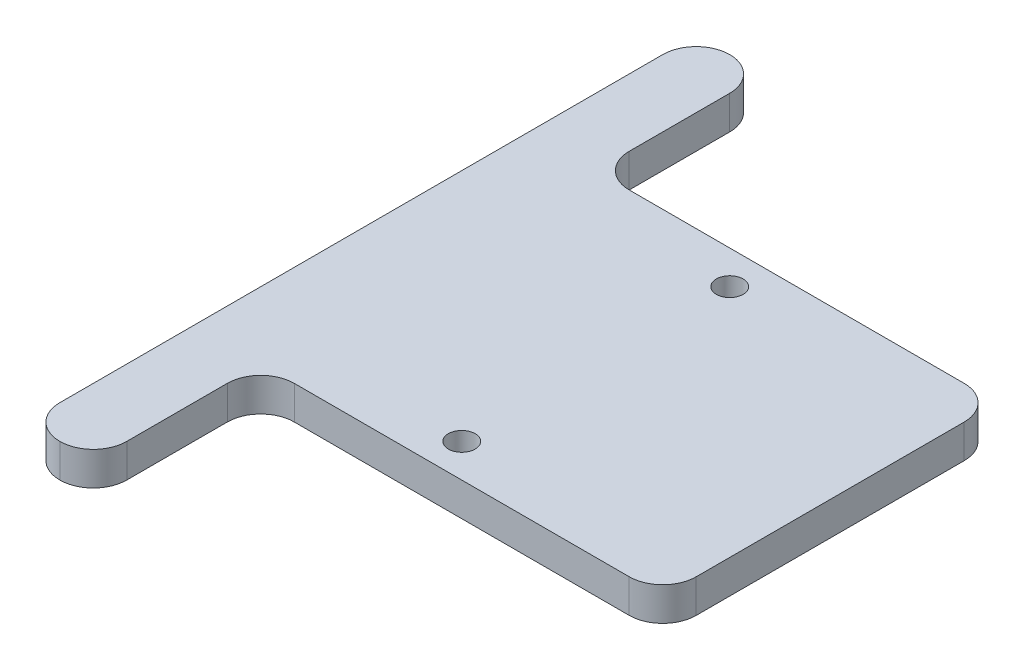
ISO-10303-21;
HEADER;
FILE_DESCRIPTION(('STEP AP214'),'2;1');
FILE_NAME('part.step','',(''),(''),'','','');
FILE_SCHEMA(('AUTOMOTIVE_DESIGN { 1 0 10303 214 1 1 1 1 }'));
ENDSEC;
DATA;
#1=APPLICATION_CONTEXT('core data for automotive mechanical design processes');
#2=APPLICATION_PROTOCOL_DEFINITION('international standard','automotive_design',2000,#1);
#3=PRODUCT_CONTEXT('',#1,'mechanical');
#4=PRODUCT('Part','Part','',(#3));
#5=PRODUCT_RELATED_PRODUCT_CATEGORY('part','',(#4));
#6=PRODUCT_DEFINITION_FORMATION('','',#4);
#7=PRODUCT_DEFINITION_CONTEXT('part definition',#1,'design');
#8=PRODUCT_DEFINITION('design','',#6,#7);
#9=PRODUCT_DEFINITION_SHAPE('','',#8);
#10=(LENGTH_UNIT() NAMED_UNIT(*) SI_UNIT(.MILLI.,.METRE.));
#11=(NAMED_UNIT(*) PLANE_ANGLE_UNIT() SI_UNIT($,.RADIAN.));
#12=(NAMED_UNIT(*) SI_UNIT($,.STERADIAN.) SOLID_ANGLE_UNIT());
#13=UNCERTAINTY_MEASURE_WITH_UNIT(LENGTH_MEASURE(1.E-05),#10,'distance_accuracy_value','');
#14=(GEOMETRIC_REPRESENTATION_CONTEXT(3) GLOBAL_UNCERTAINTY_ASSIGNED_CONTEXT((#13)) GLOBAL_UNIT_ASSIGNED_CONTEXT((#10,
#11,#12)) REPRESENTATION_CONTEXT('',''));
#15=CARTESIAN_POINT('',(0.,0.,0.));
#16=DIRECTION('',(0.,0.,1.));
#17=DIRECTION('',(1.,0.,0.));
#18=AXIS2_PLACEMENT_3D('',#15,#16,#17);
#19=CARTESIAN_POINT('',(0.,5.,0.));
#20=DIRECTION('',(0.,1.,0.));
#21=DIRECTION('',(0.,0.,1.));
#22=AXIS2_PLACEMENT_3D('',#19,#20,#21);
#23=PLANE('',#22);
#24=CARTESIAN_POINT('',(-35.,5.,-20.));
#25=DIRECTION('',(0.,1.,0.));
#26=DIRECTION('',(0.,0.,1.));
#27=AXIS2_PLACEMENT_3D('',#24,#25,#26);
#28=CIRCLE('',#27,2.);
#29=CARTESIAN_POINT('',(-35.,5.,-18.));
#30=VERTEX_POINT('',#29);
#31=EDGE_CURVE('E261',#30,#30,#28,.T.);
#32=ORIENTED_EDGE('',*,*,#31,.F.);
#33=EDGE_LOOP('',(#32));
#34=FACE_BOUND('',#33,.T.);
#35=DIRECTION('',(0.,0.,-1.));
#36=VECTOR('',#35,1.);
#37=CARTESIAN_POINT('',(0.,5.,-25.));
#38=LINE('',#37,#36);
#39=CARTESIAN_POINT('',(0.,5.,20.));
#40=VERTEX_POINT('',#39);
#41=CARTESIAN_POINT('',(0.,5.,-20.));
#42=VERTEX_POINT('',#41);
#43=EDGE_CURVE('E179',#40,#42,#38,.T.);
#44=ORIENTED_EDGE('',*,*,#43,.T.);
#45=CARTESIAN_POINT('',(-5.00000000000001,5.,-20.));
#46=DIRECTION('',(0.,1.,0.));
#47=DIRECTION('',(0.,0.,1.));
#48=AXIS2_PLACEMENT_3D('',#45,#46,#47);
#49=CIRCLE('',#48,5.);
#50=CARTESIAN_POINT('',(-5.00000000000001,5.,-25.));
#51=VERTEX_POINT('',#50);
#52=EDGE_CURVE('E211',#42,#51,#49,.T.);
#53=ORIENTED_EDGE('',*,*,#52,.T.);
#54=DIRECTION('',(-1.,0.,0.));
#55=VECTOR('',#54,1.);
#56=CARTESIAN_POINT('',(-60.,5.,-25.));
#57=LINE('',#56,#55);
#58=CARTESIAN_POINT('',(-55.,5.,-25.));
#59=VERTEX_POINT('',#58);
#60=EDGE_CURVE('E256',#51,#59,#57,.T.);
#61=ORIENTED_EDGE('',*,*,#60,.T.);
#62=CARTESIAN_POINT('',(-55.,5.,-30.));
#63=DIRECTION('',(0.,1.,0.));
#64=DIRECTION('',(0.,0.,1.));
#65=AXIS2_PLACEMENT_3D('',#62,#63,#64);
#66=CIRCLE('',#65,5.);
#67=CARTESIAN_POINT('',(-60.,5.,-30.));
#68=VERTEX_POINT('',#67);
#69=EDGE_CURVE('E146',#59,#68,#66,.F.);
#70=ORIENTED_EDGE('',*,*,#69,.T.);
#71=DIRECTION('',(0.,0.,-1.));
#72=VECTOR('',#71,1.);
#73=CARTESIAN_POINT('',(-60.,5.,-50.));
#74=LINE('',#73,#72);
#75=CARTESIAN_POINT('',(-60.,5.,-45.));
#76=VERTEX_POINT('',#75);
#77=EDGE_CURVE('E157',#68,#76,#74,.T.);
#78=ORIENTED_EDGE('',*,*,#77,.T.);
#79=CARTESIAN_POINT('',(-65.,5.,-45.));
#80=DIRECTION('',(0.,1.,0.));
#81=DIRECTION('',(0.,0.,1.));
#82=AXIS2_PLACEMENT_3D('',#79,#80,#81);
#83=CIRCLE('',#82,5.);
#84=CARTESIAN_POINT('',(-65.,5.,-50.));
#85=VERTEX_POINT('',#84);
#86=EDGE_CURVE('E203',#76,#85,#83,.T.);
#87=ORIENTED_EDGE('',*,*,#86,.T.);
#88=CARTESIAN_POINT('',(-65.,5.,-45.));
#89=DIRECTION('',(0.,1.,0.));
#90=DIRECTION('',(0.,0.,1.));
#91=AXIS2_PLACEMENT_3D('',#88,#89,#90);
#92=CIRCLE('',#91,5.);
#93=CARTESIAN_POINT('',(-70.,5.,-45.));
#94=VERTEX_POINT('',#93);
#95=EDGE_CURVE('E201',#85,#94,#92,.T.);
#96=ORIENTED_EDGE('',*,*,#95,.T.);
#97=DIRECTION('',(0.,0.,1.));
#98=VECTOR('',#97,1.);
#99=CARTESIAN_POINT('',(-70.,5.,-50.));
#100=LINE('',#99,#98);
#101=CARTESIAN_POINT('',(-70.,5.,45.));
#102=VERTEX_POINT('',#101);
#103=EDGE_CURVE('E247',#94,#102,#100,.T.);
#104=ORIENTED_EDGE('',*,*,#103,.T.);
#105=CARTESIAN_POINT('',(-65.,5.,45.));
#106=DIRECTION('',(0.,1.,0.));
#107=DIRECTION('',(0.,0.,1.));
#108=AXIS2_PLACEMENT_3D('',#105,#106,#107);
#109=CIRCLE('',#108,5.);
#110=CARTESIAN_POINT('',(-65.,5.,50.));
#111=VERTEX_POINT('',#110);
#112=EDGE_CURVE('E205',#102,#111,#109,.T.);
#113=ORIENTED_EDGE('',*,*,#112,.T.);
#114=CARTESIAN_POINT('',(-65.,5.,45.));
#115=DIRECTION('',(0.,1.,0.));
#116=DIRECTION('',(0.,0.,1.));
#117=AXIS2_PLACEMENT_3D('',#114,#115,#116);
#118=CIRCLE('',#117,5.);
#119=CARTESIAN_POINT('',(-60.,5.,45.));
#120=VERTEX_POINT('',#119);
#121=EDGE_CURVE('E207',#111,#120,#118,.T.);
#122=ORIENTED_EDGE('',*,*,#121,.T.);
#123=DIRECTION('',(0.,0.,-1.));
#124=VECTOR('',#123,1.);
#125=CARTESIAN_POINT('',(-60.,5.,25.));
#126=LINE('',#125,#124);
#127=CARTESIAN_POINT('',(-60.,5.,30.));
#128=VERTEX_POINT('',#127);
#129=EDGE_CURVE('E253',#120,#128,#126,.T.);
#130=ORIENTED_EDGE('',*,*,#129,.T.);
#131=CARTESIAN_POINT('',(-55.,5.,30.));
#132=DIRECTION('',(0.,1.,0.));
#133=DIRECTION('',(0.,0.,1.));
#134=AXIS2_PLACEMENT_3D('',#131,#132,#133);
#135=CIRCLE('',#134,5.);
#136=CARTESIAN_POINT('',(-55.,5.,25.));
#137=VERTEX_POINT('',#136);
#138=EDGE_CURVE('E11',#128,#137,#135,.F.);
#139=ORIENTED_EDGE('',*,*,#138,.T.);
#140=DIRECTION('',(1.,0.,0.));
#141=VECTOR('',#140,1.);
#142=CARTESIAN_POINT('',(-60.,5.,25.));
#143=LINE('',#142,#141);
#144=CARTESIAN_POINT('',(-5.,5.,25.));
#145=VERTEX_POINT('',#144);
#146=EDGE_CURVE('E180',#137,#145,#143,.T.);
#147=ORIENTED_EDGE('',*,*,#146,.T.);
#148=CARTESIAN_POINT('',(-5.,5.,20.));
#149=DIRECTION('',(0.,1.,0.));
#150=DIRECTION('',(0.,0.,1.));
#151=AXIS2_PLACEMENT_3D('',#148,#149,#150);
#152=CIRCLE('',#151,5.);
#153=EDGE_CURVE('E209',#145,#40,#152,.T.);
#154=ORIENTED_EDGE('',*,*,#153,.T.);
#155=EDGE_LOOP('',(#44,#53,#61,#70,#78,#87,#96,#104,#113,#122,#130,#139,#147,#154));
#156=FACE_BOUND('',#155,.T.);
#157=CARTESIAN_POINT('',(-35.,5.,20.));
#158=DIRECTION('',(0.,1.,0.));
#159=DIRECTION('',(0.,0.,-1.));
#160=AXIS2_PLACEMENT_3D('',#157,#158,#159);
#161=CIRCLE('',#160,2.);
#162=CARTESIAN_POINT('',(-35.,5.,18.));
#163=VERTEX_POINT('',#162);
#164=EDGE_CURVE('E233',#163,#163,#161,.T.);
#165=ORIENTED_EDGE('',*,*,#164,.F.);
#166=EDGE_LOOP('',(#165));
#167=FACE_BOUND('',#166,.T.);
#168=ADVANCED_FACE('F33',(#34,#156,#167),#23,.T.);
#169=CARTESIAN_POINT('',(0.,0.,0.));
#170=DIRECTION('',(0.,1.,0.));
#171=DIRECTION('',(0.,0.,1.));
#172=AXIS2_PLACEMENT_3D('',#169,#170,#171);
#173=PLANE('',#172);
#174=DIRECTION('',(-1.,0.,0.));
#175=VECTOR('',#174,1.);
#176=CARTESIAN_POINT('',(-60.,0.,-25.));
#177=LINE('',#176,#175);
#178=CARTESIAN_POINT('',(-5.00000000000001,0.,-25.));
#179=VERTEX_POINT('',#178);
#180=CARTESIAN_POINT('',(-55.,0.,-25.));
#181=VERTEX_POINT('',#180);
#182=EDGE_CURVE('E166',#179,#181,#177,.T.);
#183=ORIENTED_EDGE('',*,*,#182,.F.);
#184=CARTESIAN_POINT('',(-5.00000000000001,0.,-20.));
#185=DIRECTION('',(0.,1.,0.));
#186=DIRECTION('',(0.,0.,1.));
#187=AXIS2_PLACEMENT_3D('',#184,#185,#186);
#188=CIRCLE('',#187,5.);
#189=CARTESIAN_POINT('',(0.,0.,-20.));
#190=VERTEX_POINT('',#189);
#191=EDGE_CURVE('E194',#179,#190,#188,.F.);
#192=ORIENTED_EDGE('',*,*,#191,.T.);
#193=DIRECTION('',(0.,0.,-1.));
#194=VECTOR('',#193,1.);
#195=CARTESIAN_POINT('',(0.,0.,-25.));
#196=LINE('',#195,#194);
#197=CARTESIAN_POINT('',(0.,0.,20.));
#198=VERTEX_POINT('',#197);
#199=EDGE_CURVE('E171',#198,#190,#196,.T.);
#200=ORIENTED_EDGE('',*,*,#199,.F.);
#201=CARTESIAN_POINT('',(-5.,0.,20.));
#202=DIRECTION('',(0.,1.,0.));
#203=DIRECTION('',(0.,0.,1.));
#204=AXIS2_PLACEMENT_3D('',#201,#202,#203);
#205=CIRCLE('',#204,5.);
#206=CARTESIAN_POINT('',(-5.,0.,25.));
#207=VERTEX_POINT('',#206);
#208=EDGE_CURVE('E192',#198,#207,#205,.F.);
#209=ORIENTED_EDGE('',*,*,#208,.T.);
#210=DIRECTION('',(1.,0.,0.));
#211=VECTOR('',#210,1.);
#212=CARTESIAN_POINT('',(-60.,0.,25.));
#213=LINE('',#212,#211);
#214=CARTESIAN_POINT('',(-55.,0.,25.));
#215=VERTEX_POINT('',#214);
#216=EDGE_CURVE('E177',#215,#207,#213,.T.);
#217=ORIENTED_EDGE('',*,*,#216,.F.);
#218=CARTESIAN_POINT('',(-55.,0.,30.));
#219=DIRECTION('',(0.,1.,0.));
#220=DIRECTION('',(0.,0.,1.));
#221=AXIS2_PLACEMENT_3D('',#218,#219,#220);
#222=CIRCLE('',#221,5.);
#223=CARTESIAN_POINT('',(-60.,0.,30.));
#224=VERTEX_POINT('',#223);
#225=EDGE_CURVE('E42',#215,#224,#222,.T.);
#226=ORIENTED_EDGE('',*,*,#225,.T.);
#227=DIRECTION('',(0.,0.,-1.));
#228=VECTOR('',#227,1.);
#229=CARTESIAN_POINT('',(-60.,0.,25.));
#230=LINE('',#229,#228);
#231=CARTESIAN_POINT('',(-60.,0.,45.));
#232=VERTEX_POINT('',#231);
#233=EDGE_CURVE('E169',#232,#224,#230,.T.);
#234=ORIENTED_EDGE('',*,*,#233,.F.);
#235=CARTESIAN_POINT('',(-65.,0.,45.));
#236=DIRECTION('',(0.,1.,0.));
#237=DIRECTION('',(0.,0.,1.));
#238=AXIS2_PLACEMENT_3D('',#235,#236,#237);
#239=CIRCLE('',#238,5.);
#240=CARTESIAN_POINT('',(-65.,0.,50.));
#241=VERTEX_POINT('',#240);
#242=EDGE_CURVE('E190',#232,#241,#239,.F.);
#243=ORIENTED_EDGE('',*,*,#242,.T.);
#244=CARTESIAN_POINT('',(-65.,0.,45.));
#245=DIRECTION('',(0.,1.,0.));
#246=DIRECTION('',(0.,0.,1.));
#247=AXIS2_PLACEMENT_3D('',#244,#245,#246);
#248=CIRCLE('',#247,5.);
#249=CARTESIAN_POINT('',(-70.,0.,45.));
#250=VERTEX_POINT('',#249);
#251=EDGE_CURVE('E188',#241,#250,#248,.F.);
#252=ORIENTED_EDGE('',*,*,#251,.T.);
#253=DIRECTION('',(0.,0.,1.));
#254=VECTOR('',#253,1.);
#255=CARTESIAN_POINT('',(-70.,0.,-50.));
#256=LINE('',#255,#254);
#257=CARTESIAN_POINT('',(-70.,0.,-45.));
#258=VERTEX_POINT('',#257);
#259=EDGE_CURVE('E165',#258,#250,#256,.T.);
#260=ORIENTED_EDGE('',*,*,#259,.F.);
#261=CARTESIAN_POINT('',(-65.,0.,-45.));
#262=DIRECTION('',(0.,1.,0.));
#263=DIRECTION('',(0.,0.,1.));
#264=AXIS2_PLACEMENT_3D('',#261,#262,#263);
#265=CIRCLE('',#264,5.);
#266=CARTESIAN_POINT('',(-65.,0.,-50.));
#267=VERTEX_POINT('',#266);
#268=EDGE_CURVE('E185',#258,#267,#265,.F.);
#269=ORIENTED_EDGE('',*,*,#268,.T.);
#270=CARTESIAN_POINT('',(-65.,0.,-45.));
#271=DIRECTION('',(0.,1.,0.));
#272=DIRECTION('',(0.,0.,1.));
#273=AXIS2_PLACEMENT_3D('',#270,#271,#272);
#274=CIRCLE('',#273,5.);
#275=CARTESIAN_POINT('',(-60.,0.,-45.));
#276=VERTEX_POINT('',#275);
#277=EDGE_CURVE('E164',#267,#276,#274,.F.);
#278=ORIENTED_EDGE('',*,*,#277,.T.);
#279=DIRECTION('',(0.,0.,-1.));
#280=VECTOR('',#279,1.);
#281=CARTESIAN_POINT('',(-60.,0.,-50.));
#282=LINE('',#281,#280);
#283=CARTESIAN_POINT('',(-60.,0.,-30.));
#284=VERTEX_POINT('',#283);
#285=EDGE_CURVE('E154',#284,#276,#282,.T.);
#286=ORIENTED_EDGE('',*,*,#285,.F.);
#287=CARTESIAN_POINT('',(-55.,0.,-30.));
#288=DIRECTION('',(0.,1.,0.));
#289=DIRECTION('',(0.,0.,1.));
#290=AXIS2_PLACEMENT_3D('',#287,#288,#289);
#291=CIRCLE('',#290,5.);
#292=EDGE_CURVE('E136',#284,#181,#291,.T.);
#293=ORIENTED_EDGE('',*,*,#292,.T.);
#294=EDGE_LOOP('',(#183,#192,#200,#209,#217,#226,#234,#243,#252,#260,#269,#278,#286,#293));
#295=FACE_BOUND('',#294,.T.);
#296=CARTESIAN_POINT('',(-35.,0.,-20.));
#297=DIRECTION('',(0.,1.,0.));
#298=DIRECTION('',(0.,0.,1.));
#299=AXIS2_PLACEMENT_3D('',#296,#297,#298);
#300=CIRCLE('',#299,2.);
#301=CARTESIAN_POINT('',(-35.,0.,-18.));
#302=VERTEX_POINT('',#301);
#303=EDGE_CURVE('E266',#302,#302,#300,.T.);
#304=ORIENTED_EDGE('',*,*,#303,.T.);
#305=EDGE_LOOP('',(#304));
#306=FACE_BOUND('',#305,.T.);
#307=CARTESIAN_POINT('',(-35.,0.,20.));
#308=DIRECTION('',(0.,1.,0.));
#309=DIRECTION('',(0.,0.,-1.));
#310=AXIS2_PLACEMENT_3D('',#307,#308,#309);
#311=CIRCLE('',#310,2.);
#312=CARTESIAN_POINT('',(-35.,0.,18.));
#313=VERTEX_POINT('',#312);
#314=EDGE_CURVE('E228',#313,#313,#311,.T.);
#315=ORIENTED_EDGE('',*,*,#314,.T.);
#316=EDGE_LOOP('',(#315));
#317=FACE_BOUND('',#316,.T.);
#318=ADVANCED_FACE('F161',(#295,#306,#317),#173,.F.);
#319=CARTESIAN_POINT('',(0.,5.,-25.));
#320=DIRECTION('',(-1.,0.,0.));
#321=DIRECTION('',(0.,0.,1.));
#322=AXIS2_PLACEMENT_3D('',#319,#320,#321);
#323=PLANE('',#322);
#324=ORIENTED_EDGE('',*,*,#199,.T.);
#325=DIRECTION('',(0.,-1.,0.));
#326=VECTOR('',#325,1.);
#327=CARTESIAN_POINT('',(0.,5.,-20.));
#328=LINE('',#327,#326);
#329=EDGE_CURVE('E199',#190,#42,#328,.F.);
#330=ORIENTED_EDGE('',*,*,#329,.T.);
#331=ORIENTED_EDGE('',*,*,#43,.F.);
#332=DIRECTION('',(0.,-1.,0.));
#333=VECTOR('',#332,1.);
#334=CARTESIAN_POINT('',(0.,5.,20.));
#335=LINE('',#334,#333);
#336=EDGE_CURVE('E196',#40,#198,#335,.T.);
#337=ORIENTED_EDGE('',*,*,#336,.T.);
#338=EDGE_LOOP('',(#324,#330,#331,#337));
#339=FACE_BOUND('',#338,.T.);
#340=ADVANCED_FACE('F290',(#339),#323,.F.);
#341=CARTESIAN_POINT('',(-60.,5.,-25.));
#342=DIRECTION('',(0.,0.,1.));
#343=DIRECTION('',(1.,0.,0.));
#344=AXIS2_PLACEMENT_3D('',#341,#342,#343);
#345=PLANE('',#344);
#346=ORIENTED_EDGE('',*,*,#182,.T.);
#347=DIRECTION('',(0.,-1.,0.));
#348=VECTOR('',#347,1.);
#349=CARTESIAN_POINT('',(-55.,5.,-25.));
#350=LINE('',#349,#348);
#351=EDGE_CURVE('E141',#181,#59,#350,.F.);
#352=ORIENTED_EDGE('',*,*,#351,.T.);
#353=ORIENTED_EDGE('',*,*,#60,.F.);
#354=DIRECTION('',(0.,-1.,0.));
#355=VECTOR('',#354,1.);
#356=CARTESIAN_POINT('',(-5.00000000000001,5.,-25.));
#357=LINE('',#356,#355);
#358=EDGE_CURVE('E158',#51,#179,#357,.T.);
#359=ORIENTED_EDGE('',*,*,#358,.T.);
#360=EDGE_LOOP('',(#346,#352,#353,#359));
#361=FACE_BOUND('',#360,.T.);
#362=ADVANCED_FACE('F279',(#361),#345,.F.);
#363=CARTESIAN_POINT('',(-60.,5.,-50.));
#364=DIRECTION('',(-1.,0.,0.));
#365=DIRECTION('',(0.,0.,1.));
#366=AXIS2_PLACEMENT_3D('',#363,#364,#365);
#367=PLANE('',#366);
#368=ORIENTED_EDGE('',*,*,#77,.F.);
#369=DIRECTION('',(0.,-1.,0.));
#370=VECTOR('',#369,1.);
#371=CARTESIAN_POINT('',(-60.,0.,-30.));
#372=LINE('',#371,#370);
#373=EDGE_CURVE('E140',#68,#284,#372,.T.);
#374=ORIENTED_EDGE('',*,*,#373,.T.);
#375=ORIENTED_EDGE('',*,*,#285,.T.);
#376=DIRECTION('',(0.,-1.,0.));
#377=VECTOR('',#376,1.);
#378=CARTESIAN_POINT('',(-60.,5.,-45.));
#379=LINE('',#378,#377);
#380=EDGE_CURVE('E159',#276,#76,#379,.F.);
#381=ORIENTED_EDGE('',*,*,#380,.T.);
#382=EDGE_LOOP('',(#368,#374,#375,#381));
#383=FACE_BOUND('',#382,.T.);
#384=ADVANCED_FACE('F152',(#383),#367,.F.);
#385=CARTESIAN_POINT('',(-70.,5.,-50.));
#386=DIRECTION('',(1.,0.,0.));
#387=DIRECTION('',(0.,0.,-1.));
#388=AXIS2_PLACEMENT_3D('',#385,#386,#387);
#389=PLANE('',#388);
#390=ORIENTED_EDGE('',*,*,#259,.T.);
#391=DIRECTION('',(0.,-1.,0.));
#392=VECTOR('',#391,1.);
#393=CARTESIAN_POINT('',(-70.,5.,45.));
#394=LINE('',#393,#392);
#395=EDGE_CURVE('E147',#250,#102,#394,.F.);
#396=ORIENTED_EDGE('',*,*,#395,.T.);
#397=ORIENTED_EDGE('',*,*,#103,.F.);
#398=DIRECTION('',(0.,-1.,0.));
#399=VECTOR('',#398,1.);
#400=CARTESIAN_POINT('',(-70.,5.,-45.));
#401=LINE('',#400,#399);
#402=EDGE_CURVE('E222',#94,#258,#401,.T.);
#403=ORIENTED_EDGE('',*,*,#402,.T.);
#404=EDGE_LOOP('',(#390,#396,#397,#403));
#405=FACE_BOUND('',#404,.T.);
#406=ADVANCED_FACE('F250',(#405),#389,.F.);
#407=CARTESIAN_POINT('',(-60.,5.,25.));
#408=DIRECTION('',(-1.,0.,0.));
#409=DIRECTION('',(0.,0.,1.));
#410=AXIS2_PLACEMENT_3D('',#407,#408,#409);
#411=PLANE('',#410);
#412=ORIENTED_EDGE('',*,*,#233,.T.);
#413=DIRECTION('',(0.,-1.,0.));
#414=VECTOR('',#413,1.);
#415=CARTESIAN_POINT('',(-60.,5.,30.));
#416=LINE('',#415,#414);
#417=EDGE_CURVE('E220',#224,#128,#416,.F.);
#418=ORIENTED_EDGE('',*,*,#417,.T.);
#419=ORIENTED_EDGE('',*,*,#129,.F.);
#420=DIRECTION('',(0.,-1.,0.));
#421=VECTOR('',#420,1.);
#422=CARTESIAN_POINT('',(-60.,5.,45.));
#423=LINE('',#422,#421);
#424=EDGE_CURVE('E217',#120,#232,#423,.T.);
#425=ORIENTED_EDGE('',*,*,#424,.T.);
#426=EDGE_LOOP('',(#412,#418,#419,#425));
#427=FACE_BOUND('',#426,.T.);
#428=ADVANCED_FACE('F312',(#427),#411,.F.);
#429=CARTESIAN_POINT('',(-60.,5.,25.));
#430=DIRECTION('',(0.,0.,-1.));
#431=DIRECTION('',(-1.,0.,0.));
#432=AXIS2_PLACEMENT_3D('',#429,#430,#431);
#433=PLANE('',#432);
#434=ORIENTED_EDGE('',*,*,#216,.T.);
#435=DIRECTION('',(0.,-1.,0.));
#436=VECTOR('',#435,1.);
#437=CARTESIAN_POINT('',(-5.,5.,25.));
#438=LINE('',#437,#436);
#439=EDGE_CURVE('E50',#207,#145,#438,.F.);
#440=ORIENTED_EDGE('',*,*,#439,.T.);
#441=ORIENTED_EDGE('',*,*,#146,.F.);
#442=DIRECTION('',(0.,-1.,0.));
#443=VECTOR('',#442,1.);
#444=CARTESIAN_POINT('',(-55.,0.,25.));
#445=LINE('',#444,#443);
#446=EDGE_CURVE('E213',#137,#215,#445,.T.);
#447=ORIENTED_EDGE('',*,*,#446,.T.);
#448=EDGE_LOOP('',(#434,#440,#441,#447));
#449=FACE_BOUND('',#448,.T.);
#450=ADVANCED_FACE('F285',(#449),#433,.F.);
#451=CARTESIAN_POINT('',(-35.,5.,-20.));
#452=DIRECTION('',(0.,-1.,0.));
#453=DIRECTION('',(0.,0.,-1.));
#454=AXIS2_PLACEMENT_3D('',#451,#452,#453);
#455=CYLINDRICAL_SURFACE('',#454,2.);
#456=ORIENTED_EDGE('',*,*,#31,.T.);
#457=EDGE_LOOP('',(#456));
#458=FACE_BOUND('',#457,.T.);
#459=ORIENTED_EDGE('',*,*,#303,.F.);
#460=EDGE_LOOP('',(#459));
#461=FACE_BOUND('',#460,.T.);
#462=ADVANCED_FACE('F307',(#458,#461),#455,.F.);
#463=CARTESIAN_POINT('',(-35.,5.,20.));
#464=DIRECTION('',(0.,-1.,0.));
#465=DIRECTION('',(0.,0.,-1.));
#466=AXIS2_PLACEMENT_3D('',#463,#464,#465);
#467=CYLINDRICAL_SURFACE('',#466,2.);
#468=ORIENTED_EDGE('',*,*,#164,.T.);
#469=EDGE_LOOP('',(#468));
#470=FACE_BOUND('',#469,.T.);
#471=ORIENTED_EDGE('',*,*,#314,.F.);
#472=EDGE_LOOP('',(#471));
#473=FACE_BOUND('',#472,.T.);
#474=ADVANCED_FACE('F343',(#470,#473),#467,.F.);
#475=CARTESIAN_POINT('',(-55.,5.,-30.));
#476=DIRECTION('',(0.,1.,0.));
#477=DIRECTION('',(0.,0.,1.));
#478=AXIS2_PLACEMENT_3D('',#475,#476,#477);
#479=CYLINDRICAL_SURFACE('',#478,5.);
#480=ORIENTED_EDGE('',*,*,#69,.F.);
#481=ORIENTED_EDGE('',*,*,#351,.F.);
#482=ORIENTED_EDGE('',*,*,#292,.F.);
#483=ORIENTED_EDGE('',*,*,#373,.F.);
#484=EDGE_LOOP('',(#480,#481,#482,#483));
#485=FACE_BOUND('',#484,.T.);
#486=ADVANCED_FACE('F139',(#485),#479,.F.);
#487=CARTESIAN_POINT('',(-5.00000000000001,5.,-20.));
#488=DIRECTION('',(0.,-1.,0.));
#489=DIRECTION('',(0.,0.,-1.));
#490=AXIS2_PLACEMENT_3D('',#487,#488,#489);
#491=CYLINDRICAL_SURFACE('',#490,5.);
#492=ORIENTED_EDGE('',*,*,#52,.F.);
#493=ORIENTED_EDGE('',*,*,#329,.F.);
#494=ORIENTED_EDGE('',*,*,#191,.F.);
#495=ORIENTED_EDGE('',*,*,#358,.F.);
#496=EDGE_LOOP('',(#492,#493,#494,#495));
#497=FACE_BOUND('',#496,.T.);
#498=ADVANCED_FACE('F281',(#497),#491,.T.);
#499=CARTESIAN_POINT('',(-5.,5.,20.));
#500=DIRECTION('',(0.,-1.,0.));
#501=DIRECTION('',(0.,0.,-1.));
#502=AXIS2_PLACEMENT_3D('',#499,#500,#501);
#503=CYLINDRICAL_SURFACE('',#502,5.);
#504=ORIENTED_EDGE('',*,*,#153,.F.);
#505=ORIENTED_EDGE('',*,*,#439,.F.);
#506=ORIENTED_EDGE('',*,*,#208,.F.);
#507=ORIENTED_EDGE('',*,*,#336,.F.);
#508=EDGE_LOOP('',(#504,#505,#506,#507));
#509=FACE_BOUND('',#508,.T.);
#510=ADVANCED_FACE('F288',(#509),#503,.T.);
#511=CARTESIAN_POINT('',(-55.,5.,30.));
#512=DIRECTION('',(0.,1.,0.));
#513=DIRECTION('',(0.,0.,1.));
#514=AXIS2_PLACEMENT_3D('',#511,#512,#513);
#515=CYLINDRICAL_SURFACE('',#514,5.);
#516=ORIENTED_EDGE('',*,*,#138,.F.);
#517=ORIENTED_EDGE('',*,*,#417,.F.);
#518=ORIENTED_EDGE('',*,*,#225,.F.);
#519=ORIENTED_EDGE('',*,*,#446,.F.);
#520=EDGE_LOOP('',(#516,#517,#518,#519));
#521=FACE_BOUND('',#520,.T.);
#522=ADVANCED_FACE('F361',(#521),#515,.F.);
#523=CARTESIAN_POINT('',(-65.,5.,45.));
#524=DIRECTION('',(0.,-1.,0.));
#525=DIRECTION('',(0.,0.,-1.));
#526=AXIS2_PLACEMENT_3D('',#523,#524,#525);
#527=CYLINDRICAL_SURFACE('',#526,5.);
#528=DIRECTION('',(0.,-1.,0.));
#529=VECTOR('',#528,1.);
#530=CARTESIAN_POINT('',(-65.,5.,50.));
#531=LINE('',#530,#529);
#532=EDGE_CURVE('E226',#111,#241,#531,.T.);
#533=ORIENTED_EDGE('',*,*,#532,.F.);
#534=ORIENTED_EDGE('',*,*,#112,.F.);
#535=ORIENTED_EDGE('',*,*,#395,.F.);
#536=ORIENTED_EDGE('',*,*,#251,.F.);
#537=EDGE_LOOP('',(#533,#534,#535,#536));
#538=FACE_BOUND('',#537,.T.);
#539=ADVANCED_FACE('F370',(#538),#527,.T.);
#540=CARTESIAN_POINT('',(-65.,5.,45.));
#541=DIRECTION('',(0.,-1.,0.));
#542=DIRECTION('',(0.,0.,-1.));
#543=AXIS2_PLACEMENT_3D('',#540,#541,#542);
#544=CYLINDRICAL_SURFACE('',#543,5.);
#545=ORIENTED_EDGE('',*,*,#121,.F.);
#546=ORIENTED_EDGE('',*,*,#532,.T.);
#547=ORIENTED_EDGE('',*,*,#242,.F.);
#548=ORIENTED_EDGE('',*,*,#424,.F.);
#549=EDGE_LOOP('',(#545,#546,#547,#548));
#550=FACE_BOUND('',#549,.T.);
#551=ADVANCED_FACE('F380',(#550),#544,.T.);
#552=CARTESIAN_POINT('',(-65.,5.,-45.));
#553=DIRECTION('',(0.,-1.,0.));
#554=DIRECTION('',(0.,0.,-1.));
#555=AXIS2_PLACEMENT_3D('',#552,#553,#554);
#556=CYLINDRICAL_SURFACE('',#555,5.);
#557=ORIENTED_EDGE('',*,*,#402,.F.);
#558=ORIENTED_EDGE('',*,*,#95,.F.);
#559=DIRECTION('',(0.,-1.,0.));
#560=VECTOR('',#559,1.);
#561=CARTESIAN_POINT('',(-65.,5.,-50.));
#562=LINE('',#561,#560);
#563=EDGE_CURVE('E37',#267,#85,#562,.F.);
#564=ORIENTED_EDGE('',*,*,#563,.F.);
#565=ORIENTED_EDGE('',*,*,#268,.F.);
#566=EDGE_LOOP('',(#557,#558,#564,#565));
#567=FACE_BOUND('',#566,.T.);
#568=ADVANCED_FACE('F35',(#567),#556,.T.);
#569=CARTESIAN_POINT('',(-65.,5.,-45.));
#570=DIRECTION('',(0.,-1.,0.));
#571=DIRECTION('',(0.,0.,-1.));
#572=AXIS2_PLACEMENT_3D('',#569,#570,#571);
#573=CYLINDRICAL_SURFACE('',#572,5.);
#574=ORIENTED_EDGE('',*,*,#86,.F.);
#575=ORIENTED_EDGE('',*,*,#380,.F.);
#576=ORIENTED_EDGE('',*,*,#277,.F.);
#577=ORIENTED_EDGE('',*,*,#563,.T.);
#578=EDGE_LOOP('',(#574,#575,#576,#577));
#579=FACE_BOUND('',#578,.T.);
#580=ADVANCED_FACE('F238',(#579),#573,.T.);
#581=CLOSED_SHELL('',(#168,#318,#340,#362,#384,#406,#428,#450,#462,#474,#486,#498,#510,#522,
#539,#551,#568,#580));
#582=MANIFOLD_SOLID_BREP('B2',#581);
#583=ADVANCED_BREP_SHAPE_REPRESENTATION('',(#18,#582),#14);
#584=SHAPE_DEFINITION_REPRESENTATION(#9,#583);
ENDSEC;
END-ISO-10303-21;
